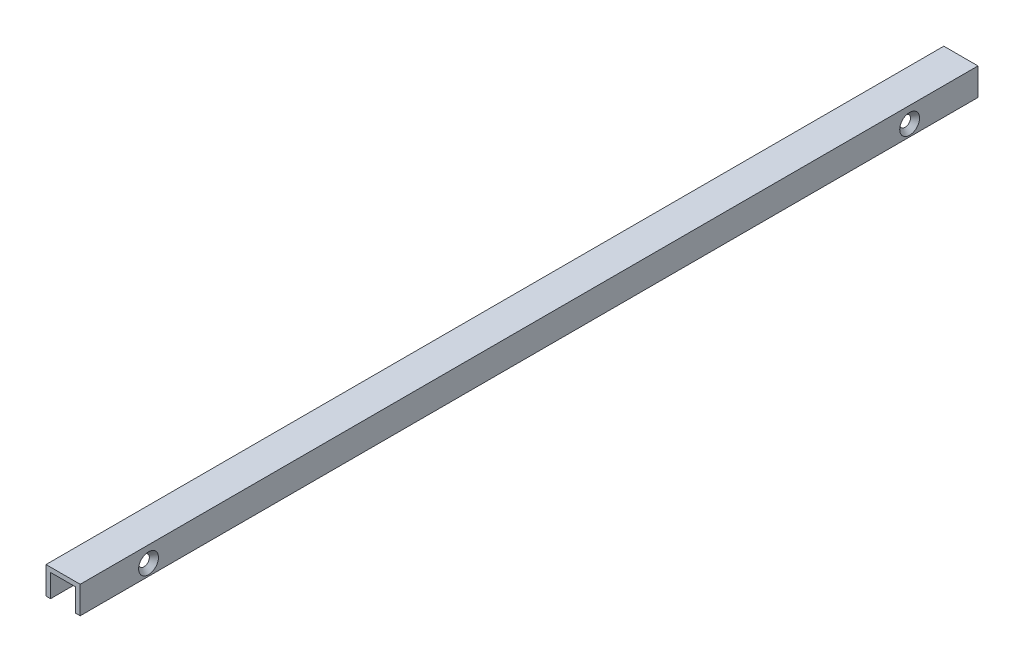
ISO-10303-21;
HEADER;
FILE_DESCRIPTION(('STEP AP214'),'2;1');
FILE_NAME('part.step','',(''),(''),'','','');
FILE_SCHEMA(('AUTOMOTIVE_DESIGN { 1 0 10303 214 1 1 1 1 }'));
ENDSEC;
DATA;
#1=APPLICATION_CONTEXT('core data for automotive mechanical design processes');
#2=APPLICATION_PROTOCOL_DEFINITION('international standard','automotive_design',2000,#1);
#3=PRODUCT_CONTEXT('',#1,'mechanical');
#4=PRODUCT('Part','Part','',(#3));
#5=PRODUCT_RELATED_PRODUCT_CATEGORY('part','',(#4));
#6=PRODUCT_DEFINITION_FORMATION('','',#4);
#7=PRODUCT_DEFINITION_CONTEXT('part definition',#1,'design');
#8=PRODUCT_DEFINITION('design','',#6,#7);
#9=PRODUCT_DEFINITION_SHAPE('','',#8);
#10=(LENGTH_UNIT() NAMED_UNIT(*) SI_UNIT(.MILLI.,.METRE.));
#11=(NAMED_UNIT(*) PLANE_ANGLE_UNIT() SI_UNIT($,.RADIAN.));
#12=(NAMED_UNIT(*) SI_UNIT($,.STERADIAN.) SOLID_ANGLE_UNIT());
#13=UNCERTAINTY_MEASURE_WITH_UNIT(LENGTH_MEASURE(1.E-05),#10,'distance_accuracy_value','');
#14=(GEOMETRIC_REPRESENTATION_CONTEXT(3) GLOBAL_UNCERTAINTY_ASSIGNED_CONTEXT((#13)) GLOBAL_UNIT_ASSIGNED_CONTEXT((#10,
#11,#12)) REPRESENTATION_CONTEXT('',''));
#15=CARTESIAN_POINT('',(0.,0.,0.));
#16=DIRECTION('',(0.,0.,1.));
#17=DIRECTION('',(1.,0.,0.));
#18=AXIS2_PLACEMENT_3D('',#15,#16,#17);
#19=CARTESIAN_POINT('',(0.,10.,-394.));
#20=DIRECTION('',(1.,0.,0.));
#21=DIRECTION('',(0.,1.,0.));
#22=AXIS2_PLACEMENT_3D('',#19,#20,#21);
#23=PLANE('',#22);
#24=DIRECTION('',(0.,1.,0.));
#25=VECTOR('',#24,1.);
#26=CARTESIAN_POINT('',(0.,10.,0.));
#27=LINE('',#26,#25);
#28=CARTESIAN_POINT('',(0.,0.,0.));
#29=VERTEX_POINT('',#28);
#30=CARTESIAN_POINT('',(0.,10.,0.));
#31=VERTEX_POINT('',#30);
#32=EDGE_CURVE('E139',#29,#31,#27,.T.);
#33=ORIENTED_EDGE('',*,*,#32,.F.);
#34=DIRECTION('',(0.,0.,1.));
#35=VECTOR('',#34,1.);
#36=CARTESIAN_POINT('',(0.,0.,-394.));
#37=LINE('',#36,#35);
#38=CARTESIAN_POINT('',(0.,0.,-394.));
#39=VERTEX_POINT('',#38);
#40=EDGE_CURVE('E56',#39,#29,#37,.T.);
#41=ORIENTED_EDGE('',*,*,#40,.F.);
#42=DIRECTION('',(0.,1.,0.));
#43=VECTOR('',#42,1.);
#44=CARTESIAN_POINT('',(0.,10.,-394.));
#45=LINE('',#44,#43);
#46=CARTESIAN_POINT('',(0.,10.,-394.));
#47=VERTEX_POINT('',#46);
#48=EDGE_CURVE('E160',#39,#47,#45,.T.);
#49=ORIENTED_EDGE('',*,*,#48,.T.);
#50=DIRECTION('',(0.,0.,1.));
#51=VECTOR('',#50,1.);
#52=CARTESIAN_POINT('',(0.,10.,-394.));
#53=LINE('',#52,#51);
#54=EDGE_CURVE('E97',#47,#31,#53,.T.);
#55=ORIENTED_EDGE('',*,*,#54,.T.);
#56=EDGE_LOOP('',(#33,#41,#49,#55));
#57=FACE_BOUND('',#56,.T.);
#58=ADVANCED_FACE('F39',(#57),#23,.T.);
#59=CARTESIAN_POINT('',(0.,0.,-394.));
#60=DIRECTION('',(0.,-1.,0.));
#61=DIRECTION('',(1.,0.,0.));
#62=AXIS2_PLACEMENT_3D('',#59,#60,#61);
#63=PLANE('',#62);
#64=DIRECTION('',(1.,0.,0.));
#65=VECTOR('',#64,1.);
#66=CARTESIAN_POINT('',(0.,0.,0.));
#67=LINE('',#66,#65);
#68=CARTESIAN_POINT('',(-2.,0.,0.));
#69=VERTEX_POINT('',#68);
#70=EDGE_CURVE('E157',#69,#29,#67,.T.);
#71=ORIENTED_EDGE('',*,*,#70,.F.);
#72=DIRECTION('',(0.,0.,1.));
#73=VECTOR('',#72,1.);
#74=CARTESIAN_POINT('',(-2.,0.,-394.));
#75=LINE('',#74,#73);
#76=CARTESIAN_POINT('',(-2.,0.,-394.));
#77=VERTEX_POINT('',#76);
#78=EDGE_CURVE('E85',#77,#69,#75,.T.);
#79=ORIENTED_EDGE('',*,*,#78,.F.);
#80=DIRECTION('',(1.,0.,0.));
#81=VECTOR('',#80,1.);
#82=CARTESIAN_POINT('',(0.,0.,-394.));
#83=LINE('',#82,#81);
#84=EDGE_CURVE('E129',#77,#39,#83,.T.);
#85=ORIENTED_EDGE('',*,*,#84,.T.);
#86=ORIENTED_EDGE('',*,*,#40,.T.);
#87=EDGE_LOOP('',(#71,#79,#85,#86));
#88=FACE_BOUND('',#87,.T.);
#89=ADVANCED_FACE('F209',(#88),#63,.T.);
#90=CARTESIAN_POINT('',(-2.,0.,-394.));
#91=DIRECTION('',(-1.,0.,0.));
#92=DIRECTION('',(0.,0.,1.));
#93=AXIS2_PLACEMENT_3D('',#90,#91,#92);
#94=PLANE('',#93);
#95=DIRECTION('',(0.,-1.,0.));
#96=VECTOR('',#95,1.);
#97=CARTESIAN_POINT('',(-2.,0.,0.));
#98=LINE('',#97,#96);
#99=CARTESIAN_POINT('',(-2.,12.,0.));
#100=VERTEX_POINT('',#99);
#101=EDGE_CURVE('E116',#100,#69,#98,.T.);
#102=ORIENTED_EDGE('',*,*,#101,.F.);
#103=DIRECTION('',(0.,0.,1.));
#104=VECTOR('',#103,1.);
#105=CARTESIAN_POINT('',(-2.,12.,-394.));
#106=LINE('',#105,#104);
#107=CARTESIAN_POINT('',(-2.,12.,-394.));
#108=VERTEX_POINT('',#107);
#109=EDGE_CURVE('E111',#108,#100,#106,.T.);
#110=ORIENTED_EDGE('',*,*,#109,.F.);
#111=DIRECTION('',(0.,-1.,0.));
#112=VECTOR('',#111,1.);
#113=CARTESIAN_POINT('',(-2.,0.,-394.));
#114=LINE('',#113,#112);
#115=EDGE_CURVE('E114',#108,#77,#114,.T.);
#116=ORIENTED_EDGE('',*,*,#115,.T.);
#117=ORIENTED_EDGE('',*,*,#78,.T.);
#118=EDGE_LOOP('',(#102,#110,#116,#117));
#119=FACE_BOUND('',#118,.T.);
#120=ADVANCED_FACE('F113',(#119),#94,.T.);
#121=CARTESIAN_POINT('',(-2.,12.,-394.));
#122=DIRECTION('',(0.,1.,0.));
#123=DIRECTION('',(0.,0.,1.));
#124=AXIS2_PLACEMENT_3D('',#121,#122,#123);
#125=PLANE('',#124);
#126=DIRECTION('',(-1.,0.,0.));
#127=VECTOR('',#126,1.);
#128=CARTESIAN_POINT('',(-2.,12.,0.));
#129=LINE('',#128,#127);
#130=CARTESIAN_POINT('',(13.,12.,0.));
#131=VERTEX_POINT('',#130);
#132=EDGE_CURVE('E154',#131,#100,#129,.T.);
#133=ORIENTED_EDGE('',*,*,#132,.F.);
#134=DIRECTION('',(0.,0.,1.));
#135=VECTOR('',#134,1.);
#136=CARTESIAN_POINT('',(13.,12.,-394.));
#137=LINE('',#136,#135);
#138=CARTESIAN_POINT('',(13.,12.,-394.));
#139=VERTEX_POINT('',#138);
#140=EDGE_CURVE('E121',#139,#131,#137,.T.);
#141=ORIENTED_EDGE('',*,*,#140,.F.);
#142=DIRECTION('',(-1.,0.,0.));
#143=VECTOR('',#142,1.);
#144=CARTESIAN_POINT('',(-2.,12.,-394.));
#145=LINE('',#144,#143);
#146=EDGE_CURVE('E127',#139,#108,#145,.T.);
#147=ORIENTED_EDGE('',*,*,#146,.T.);
#148=ORIENTED_EDGE('',*,*,#109,.T.);
#149=EDGE_LOOP('',(#133,#141,#147,#148));
#150=FACE_BOUND('',#149,.T.);
#151=ADVANCED_FACE('F131',(#150),#125,.T.);
#152=CARTESIAN_POINT('',(13.,12.,-394.));
#153=DIRECTION('',(1.,0.,0.));
#154=DIRECTION('',(0.,1.,0.));
#155=AXIS2_PLACEMENT_3D('',#152,#153,#154);
#156=PLANE('',#155);
#157=CARTESIAN_POINT('',(13.,5.,-364.));
#158=DIRECTION('',(1.,0.,0.));
#159=DIRECTION('',(0.,1.,0.));
#160=AXIS2_PLACEMENT_3D('',#157,#158,#159);
#161=CIRCLE('',#160,4.35000000000008);
#162=CARTESIAN_POINT('',(13.,9.35000000000008,-364.));
#163=VERTEX_POINT('',#162);
#164=EDGE_CURVE('E11',#163,#163,#161,.F.);
#165=ORIENTED_EDGE('',*,*,#164,.T.);
#166=EDGE_LOOP('',(#165));
#167=FACE_BOUND('',#166,.T.);
#168=CARTESIAN_POINT('',(13.,5.,-30.));
#169=DIRECTION('',(1.,0.,0.));
#170=DIRECTION('',(0.,1.,0.));
#171=AXIS2_PLACEMENT_3D('',#168,#169,#170);
#172=CIRCLE('',#171,4.35000000000001);
#173=CARTESIAN_POINT('',(13.,9.35000000000001,-30.));
#174=VERTEX_POINT('',#173);
#175=EDGE_CURVE('E48',#174,#174,#172,.F.);
#176=ORIENTED_EDGE('',*,*,#175,.T.);
#177=EDGE_LOOP('',(#176));
#178=FACE_BOUND('',#177,.T.);
#179=DIRECTION('',(0.,1.,0.));
#180=VECTOR('',#179,1.);
#181=CARTESIAN_POINT('',(13.,12.,0.));
#182=LINE('',#181,#180);
#183=CARTESIAN_POINT('',(13.,0.,0.));
#184=VERTEX_POINT('',#183);
#185=EDGE_CURVE('E151',#184,#131,#182,.T.);
#186=ORIENTED_EDGE('',*,*,#185,.F.);
#187=DIRECTION('',(0.,0.,1.));
#188=VECTOR('',#187,1.);
#189=CARTESIAN_POINT('',(13.,0.,-394.));
#190=LINE('',#189,#188);
#191=CARTESIAN_POINT('',(13.,0.,-394.));
#192=VERTEX_POINT('',#191);
#193=EDGE_CURVE('E165',#192,#184,#190,.T.);
#194=ORIENTED_EDGE('',*,*,#193,.F.);
#195=DIRECTION('',(0.,1.,0.));
#196=VECTOR('',#195,1.);
#197=CARTESIAN_POINT('',(13.,12.,-394.));
#198=LINE('',#197,#196);
#199=EDGE_CURVE('E132',#192,#139,#198,.T.);
#200=ORIENTED_EDGE('',*,*,#199,.T.);
#201=ORIENTED_EDGE('',*,*,#140,.T.);
#202=EDGE_LOOP('',(#186,#194,#200,#201));
#203=FACE_BOUND('',#202,.T.);
#204=ADVANCED_FACE('F179',(#167,#178,#203),#156,.T.);
#205=CARTESIAN_POINT('',(13.,0.,-394.));
#206=DIRECTION('',(0.,-1.,0.));
#207=DIRECTION('',(1.,0.,0.));
#208=AXIS2_PLACEMENT_3D('',#205,#206,#207);
#209=PLANE('',#208);
#210=DIRECTION('',(1.,0.,0.));
#211=VECTOR('',#210,1.);
#212=CARTESIAN_POINT('',(13.,0.,0.));
#213=LINE('',#212,#211);
#214=CARTESIAN_POINT('',(11.,0.,0.));
#215=VERTEX_POINT('',#214);
#216=EDGE_CURVE('E148',#215,#184,#213,.T.);
#217=ORIENTED_EDGE('',*,*,#216,.F.);
#218=DIRECTION('',(0.,0.,1.));
#219=VECTOR('',#218,1.);
#220=CARTESIAN_POINT('',(11.,0.,-394.));
#221=LINE('',#220,#219);
#222=CARTESIAN_POINT('',(11.,0.,-394.));
#223=VERTEX_POINT('',#222);
#224=EDGE_CURVE('E167',#223,#215,#221,.T.);
#225=ORIENTED_EDGE('',*,*,#224,.F.);
#226=DIRECTION('',(1.,0.,0.));
#227=VECTOR('',#226,1.);
#228=CARTESIAN_POINT('',(13.,0.,-394.));
#229=LINE('',#228,#227);
#230=EDGE_CURVE('E134',#223,#192,#229,.T.);
#231=ORIENTED_EDGE('',*,*,#230,.T.);
#232=ORIENTED_EDGE('',*,*,#193,.T.);
#233=EDGE_LOOP('',(#217,#225,#231,#232));
#234=FACE_BOUND('',#233,.T.);
#235=ADVANCED_FACE('F191',(#234),#209,.T.);
#236=CARTESIAN_POINT('',(11.,0.,-394.));
#237=DIRECTION('',(-1.,0.,0.));
#238=DIRECTION('',(0.,-1.,0.));
#239=AXIS2_PLACEMENT_3D('',#236,#237,#238);
#240=PLANE('',#239);
#241=CARTESIAN_POINT('',(11.,5.,-364.));
#242=DIRECTION('',(-1.,0.,0.));
#243=DIRECTION('',(0.,-1.,0.));
#244=AXIS2_PLACEMENT_3D('',#241,#242,#243);
#245=CIRCLE('',#244,2.35000000000007);
#246=CARTESIAN_POINT('',(11.,2.64999999999993,-364.));
#247=VERTEX_POINT('',#246);
#248=EDGE_CURVE('E174',#247,#247,#245,.F.);
#249=ORIENTED_EDGE('',*,*,#248,.T.);
#250=EDGE_LOOP('',(#249));
#251=FACE_BOUND('',#250,.T.);
#252=CARTESIAN_POINT('',(11.,5.,-30.));
#253=DIRECTION('',(-1.,0.,0.));
#254=DIRECTION('',(0.,-1.,0.));
#255=AXIS2_PLACEMENT_3D('',#252,#253,#254);
#256=CIRCLE('',#255,2.35000000000004);
#257=CARTESIAN_POINT('',(11.,2.64999999999996,-30.));
#258=VERTEX_POINT('',#257);
#259=EDGE_CURVE('E162',#258,#258,#256,.F.);
#260=ORIENTED_EDGE('',*,*,#259,.T.);
#261=EDGE_LOOP('',(#260));
#262=FACE_BOUND('',#261,.T.);
#263=DIRECTION('',(0.,-1.,0.));
#264=VECTOR('',#263,1.);
#265=CARTESIAN_POINT('',(11.,0.,0.));
#266=LINE('',#265,#264);
#267=CARTESIAN_POINT('',(11.,10.,0.));
#268=VERTEX_POINT('',#267);
#269=EDGE_CURVE('E145',#268,#215,#266,.T.);
#270=ORIENTED_EDGE('',*,*,#269,.F.);
#271=DIRECTION('',(0.,0.,1.));
#272=VECTOR('',#271,1.);
#273=CARTESIAN_POINT('',(11.,10.,-394.));
#274=LINE('',#273,#272);
#275=CARTESIAN_POINT('',(11.,10.,-394.));
#276=VERTEX_POINT('',#275);
#277=EDGE_CURVE('E169',#276,#268,#274,.T.);
#278=ORIENTED_EDGE('',*,*,#277,.F.);
#279=DIRECTION('',(0.,-1.,0.));
#280=VECTOR('',#279,1.);
#281=CARTESIAN_POINT('',(11.,0.,-394.));
#282=LINE('',#281,#280);
#283=EDGE_CURVE('E201',#276,#223,#282,.T.);
#284=ORIENTED_EDGE('',*,*,#283,.T.);
#285=ORIENTED_EDGE('',*,*,#224,.T.);
#286=EDGE_LOOP('',(#270,#278,#284,#285));
#287=FACE_BOUND('',#286,.T.);
#288=ADVANCED_FACE('F187',(#251,#262,#287),#240,.T.);
#289=CARTESIAN_POINT('',(0.,10.,-394.));
#290=DIRECTION('',(0.,-1.,0.));
#291=DIRECTION('',(0.,0.,-1.));
#292=AXIS2_PLACEMENT_3D('',#289,#290,#291);
#293=PLANE('',#292);
#294=DIRECTION('',(1.,0.,0.));
#295=VECTOR('',#294,1.);
#296=CARTESIAN_POINT('',(0.,10.,0.));
#297=LINE('',#296,#295);
#298=EDGE_CURVE('E142',#31,#268,#297,.T.);
#299=ORIENTED_EDGE('',*,*,#298,.F.);
#300=ORIENTED_EDGE('',*,*,#54,.F.);
#301=DIRECTION('',(1.,0.,0.));
#302=VECTOR('',#301,1.);
#303=CARTESIAN_POINT('',(0.,10.,-394.));
#304=LINE('',#303,#302);
#305=EDGE_CURVE('E200',#47,#276,#304,.T.);
#306=ORIENTED_EDGE('',*,*,#305,.T.);
#307=ORIENTED_EDGE('',*,*,#277,.T.);
#308=EDGE_LOOP('',(#299,#300,#306,#307));
#309=FACE_BOUND('',#308,.T.);
#310=ADVANCED_FACE('F190',(#309),#293,.T.);
#311=CARTESIAN_POINT('',(0.,0.,-394.));
#312=DIRECTION('',(0.,0.,-1.));
#313=DIRECTION('',(-1.,0.,0.));
#314=AXIS2_PLACEMENT_3D('',#311,#312,#313);
#315=PLANE('',#314);
#316=ORIENTED_EDGE('',*,*,#48,.F.);
#317=ORIENTED_EDGE('',*,*,#84,.F.);
#318=ORIENTED_EDGE('',*,*,#115,.F.);
#319=ORIENTED_EDGE('',*,*,#146,.F.);
#320=ORIENTED_EDGE('',*,*,#199,.F.);
#321=ORIENTED_EDGE('',*,*,#230,.F.);
#322=ORIENTED_EDGE('',*,*,#283,.F.);
#323=ORIENTED_EDGE('',*,*,#305,.F.);
#324=EDGE_LOOP('',(#316,#317,#318,#319,#320,#321,#322,#323));
#325=FACE_BOUND('',#324,.T.);
#326=ADVANCED_FACE('F125',(#325),#315,.T.);
#327=CARTESIAN_POINT('',(0.,0.,0.));
#328=DIRECTION('',(0.,0.,-1.));
#329=DIRECTION('',(-1.,0.,0.));
#330=AXIS2_PLACEMENT_3D('',#327,#328,#329);
#331=PLANE('',#330);
#332=ORIENTED_EDGE('',*,*,#32,.T.);
#333=ORIENTED_EDGE('',*,*,#298,.T.);
#334=ORIENTED_EDGE('',*,*,#269,.T.);
#335=ORIENTED_EDGE('',*,*,#216,.T.);
#336=ORIENTED_EDGE('',*,*,#185,.T.);
#337=ORIENTED_EDGE('',*,*,#132,.T.);
#338=ORIENTED_EDGE('',*,*,#101,.T.);
#339=ORIENTED_EDGE('',*,*,#70,.T.);
#340=EDGE_LOOP('',(#332,#333,#334,#335,#336,#337,#338,#339));
#341=FACE_BOUND('',#340,.T.);
#342=ADVANCED_FACE('F199',(#341),#331,.F.);
#343=CARTESIAN_POINT('',(10.95,5.,-364.));
#344=DIRECTION('',(1.,0.,0.));
#345=DIRECTION('',(0.,0.,-1.));
#346=AXIS2_PLACEMENT_3D('',#343,#344,#345);
#347=CONICAL_SURFACE('',#346,2.30000000000003,0.78539816339745);
#348=ORIENTED_EDGE('',*,*,#164,.F.);
#349=EDGE_LOOP('',(#348));
#350=FACE_BOUND('',#349,.T.);
#351=ORIENTED_EDGE('',*,*,#248,.F.);
#352=EDGE_LOOP('',(#351));
#353=FACE_BOUND('',#352,.T.);
#354=ADVANCED_FACE('F184',(#350,#353),#347,.F.);
#355=CARTESIAN_POINT('',(10.95,5.,-30.));
#356=DIRECTION('',(1.,0.,0.));
#357=DIRECTION('',(0.,0.,-1.));
#358=AXIS2_PLACEMENT_3D('',#355,#356,#357);
#359=CONICAL_SURFACE('',#358,2.3,0.785398163397443);
#360=ORIENTED_EDGE('',*,*,#175,.F.);
#361=EDGE_LOOP('',(#360));
#362=FACE_BOUND('',#361,.T.);
#363=ORIENTED_EDGE('',*,*,#259,.F.);
#364=EDGE_LOOP('',(#363));
#365=FACE_BOUND('',#364,.T.);
#366=ADVANCED_FACE('F41',(#362,#365),#359,.F.);
#367=CLOSED_SHELL('',(#58,#89,#120,#151,#204,#235,#288,#310,#326,#342,#354,#366));
#368=MANIFOLD_SOLID_BREP('B2',#367);
#369=ADVANCED_BREP_SHAPE_REPRESENTATION('',(#18,#368),#14);
#370=SHAPE_DEFINITION_REPRESENTATION(#9,#369);
ENDSEC;
END-ISO-10303-21;
